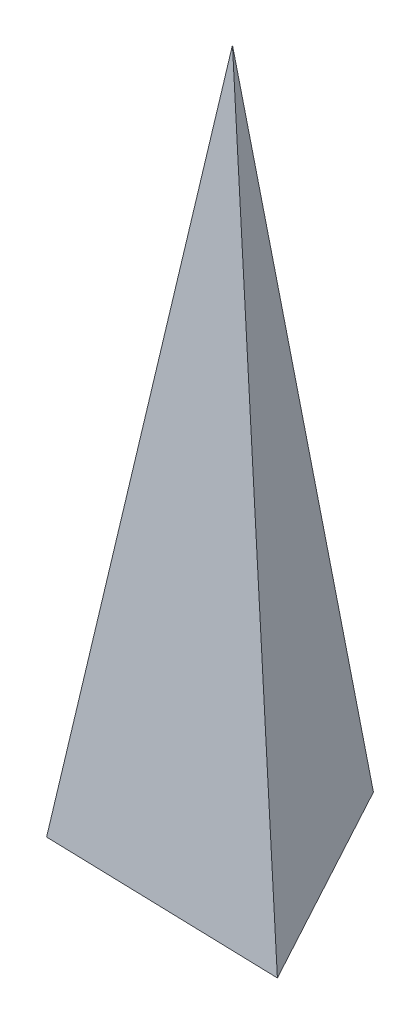
ISO-10303-21;
HEADER;
FILE_DESCRIPTION(('STEP AP214'),'2;1');
FILE_NAME('part.step','',(''),(''),'','','');
FILE_SCHEMA(('AUTOMOTIVE_DESIGN { 1 0 10303 214 1 1 1 1 }'));
ENDSEC;
DATA;
#1=APPLICATION_CONTEXT('core data for automotive mechanical design processes');
#2=APPLICATION_PROTOCOL_DEFINITION('international standard','automotive_design',2000,#1);
#3=PRODUCT_CONTEXT('',#1,'mechanical');
#4=PRODUCT('Part','Part','',(#3));
#5=PRODUCT_RELATED_PRODUCT_CATEGORY('part','',(#4));
#6=PRODUCT_DEFINITION_FORMATION('','',#4);
#7=PRODUCT_DEFINITION_CONTEXT('part definition',#1,'design');
#8=PRODUCT_DEFINITION('design','',#6,#7);
#9=PRODUCT_DEFINITION_SHAPE('','',#8);
#10=(LENGTH_UNIT() NAMED_UNIT(*) SI_UNIT(.MILLI.,.METRE.));
#11=(NAMED_UNIT(*) PLANE_ANGLE_UNIT() SI_UNIT($,.RADIAN.));
#12=(NAMED_UNIT(*) SI_UNIT($,.STERADIAN.) SOLID_ANGLE_UNIT());
#13=UNCERTAINTY_MEASURE_WITH_UNIT(LENGTH_MEASURE(1.E-05),#10,'distance_accuracy_value','');
#14=(GEOMETRIC_REPRESENTATION_CONTEXT(3) GLOBAL_UNCERTAINTY_ASSIGNED_CONTEXT((#13)) GLOBAL_UNIT_ASSIGNED_CONTEXT((#10,
#11,#12)) REPRESENTATION_CONTEXT('',''));
#15=CARTESIAN_POINT('',(0.,0.,0.));
#16=DIRECTION('',(0.,0.,1.));
#17=DIRECTION('',(1.,0.,0.));
#18=AXIS2_PLACEMENT_3D('',#15,#16,#17);
#19=CARTESIAN_POINT('',(-12.6975323008911,0.,6.86338158644562));
#20=DIRECTION('',(-0.0279238469086223,0.0956720216510585,0.995021167135164));
#21=DIRECTION('',(0.,-0.995409323658619,0.0957093431880695));
#22=AXIS2_PLACEMENT_3D('',#19,#20,#21);
#23=PLANE('',#22);
#24=DIRECTION('',(0.999606450442595,0.,0.0280525263310692));
#25=VECTOR('',#24,1.);
#26=CARTESIAN_POINT('',(-12.6975323008911,0.,6.86338158644562));
#27=LINE('',#26,#25);
#28=CARTESIAN_POINT('',(-12.6975323008911,0.,6.86338158644562));
#29=VERTEX_POINT('',#28);
#30=CARTESIAN_POINT('',(12.2926289601738,0.,7.56469474472235));
#31=VERTEX_POINT('',#30);
#32=EDGE_CURVE('E73',#29,#31,#27,.T.);
#33=ORIENTED_EDGE('',*,*,#32,.T.);
#34=DIRECTION('',(0.160767405181608,-0.98202135774224,0.0989337878040668));
#35=VECTOR('',#34,1.);
#36=CARTESIAN_POINT('',(12.2926289601738,0.,7.56469474472235));
#37=LINE('',#36,#35);
#38=CARTESIAN_POINT('',(0.0143263616009179,75.,0.00881622252364104));
#39=VERTEX_POINT('',#38);
#40=EDGE_CURVE('E11',#39,#31,#37,.T.);
#41=ORIENTED_EDGE('',*,*,#40,.F.);
#42=DIRECTION('',(-0.999606450442595,0.,-0.0280525263310692));
#43=VECTOR('',#42,1.);
#44=CARTESIAN_POINT('',(-12.4953165764677,75.,-0.342249026962356));
#45=LINE('',#44,#43);
#46=CARTESIAN_POINT('',(-0.014798253471346,75.,0.00799888182837455));
#47=VERTEX_POINT('',#46);
#48=EDGE_CURVE('E85',#47,#39,#45,.F.);
#49=ORIENTED_EDGE('',*,*,#48,.F.);
#50=DIRECTION('',(-0.166062876121745,-0.98202135774224,0.0897617630857453));
#51=VECTOR('',#50,1.);
#52=CARTESIAN_POINT('',(-12.6975323008911,0.,6.86338158644562));
#53=LINE('',#52,#51);
#54=EDGE_CURVE('E82',#47,#29,#53,.T.);
#55=ORIENTED_EDGE('',*,*,#54,.T.);
#56=EDGE_LOOP('',(#33,#41,#49,#55));
#57=FACE_BOUND('',#56,.T.);
#58=ADVANCED_FACE('F35',(#57),#23,.T.);
#59=CARTESIAN_POINT('',(12.2926289601738,0.,7.56469474472235));
#60=DIRECTION('',(0.875675531496605,0.0956720216510585,-0.473327822773327));
#61=DIRECTION('',(-0.47550902477826,0.,-0.879710843035613));
#62=AXIS2_PLACEMENT_3D('',#59,#60,#61);
#63=PLANE('',#62);
#64=DIRECTION('',(-0.47550902477826,0.,-0.879710843035613));
#65=VECTOR('',#64,1.);
#66=CARTESIAN_POINT('',(12.2926289601738,0.,7.56469474472235));
#67=LINE('',#66,#65);
#68=CARTESIAN_POINT('',(0.404903340717301,0.,-14.428076331168));
#69=VERTEX_POINT('',#68);
#70=EDGE_CURVE('E70',#31,#69,#67,.T.);
#71=ORIENTED_EDGE('',*,*,#70,.T.);
#72=DIRECTION('',(0.00529547094013685,-0.98202135774224,-0.188695550889812));
#73=VECTOR('',#72,1.);
#74=CARTESIAN_POINT('',(0.404903340717303,0.,-14.428076331168));
#75=LINE('',#74,#73);
#76=CARTESIAN_POINT('',(0.000471891870433183,75.,-0.0168151043520161));
#77=VERTEX_POINT('',#76);
#78=EDGE_CURVE('E44',#77,#69,#75,.T.);
#79=ORIENTED_EDGE('',*,*,#78,.F.);
#80=DIRECTION('',(0.47550902477826,0.,0.879710843035613));
#81=VECTOR('',#80,1.);
#82=CARTESIAN_POINT('',(5.95126193646392,75.,10.992386097031));
#83=LINE('',#82,#81);
#84=EDGE_CURVE('E55',#39,#77,#83,.F.);
#85=ORIENTED_EDGE('',*,*,#84,.F.);
#86=ORIENTED_EDGE('',*,*,#40,.T.);
#87=EDGE_LOOP('',(#71,#79,#85,#86));
#88=FACE_BOUND('',#87,.T.);
#89=ADVANCED_FACE('F37',(#88),#63,.T.);
#90=CARTESIAN_POINT('',(0.404903340717301,0.,-14.428076331168));
#91=DIRECTION('',(-0.847751684587982,0.0956720216510585,-0.521693344361837));
#92=DIRECTION('',(-0.524097425664336,0.,0.851658316704543));
#93=AXIS2_PLACEMENT_3D('',#90,#91,#92);
#94=PLANE('',#93);
#95=DIRECTION('',(-0.524097425664336,0.,0.851658316704543));
#96=VECTOR('',#95,1.);
#97=CARTESIAN_POINT('',(0.404903340717301,0.,-14.428076331168));
#98=LINE('',#97,#96);
#99=EDGE_CURVE('E74',#69,#29,#98,.T.);
#100=ORIENTED_EDGE('',*,*,#99,.T.);
#101=ORIENTED_EDGE('',*,*,#54,.F.);
#102=DIRECTION('',(0.524097425664336,0.,-0.851658316704543));
#103=VECTOR('',#102,1.);
#104=CARTESIAN_POINT('',(6.54405464000374,75.,-10.6501370700686));
#105=LINE('',#104,#103);
#106=EDGE_CURVE('E39',#77,#47,#105,.F.);
#107=ORIENTED_EDGE('',*,*,#106,.F.);
#108=ORIENTED_EDGE('',*,*,#78,.T.);
#109=EDGE_LOOP('',(#100,#101,#107,#108));
#110=FACE_BOUND('',#109,.T.);
#111=ADVANCED_FACE('F91',(#110),#94,.T.);
#112=CARTESIAN_POINT('',(0.,75.,0.));
#113=DIRECTION('',(0.,1.,0.));
#114=DIRECTION('',(0.,0.,1.));
#115=AXIS2_PLACEMENT_3D('',#112,#113,#114);
#116=PLANE('',#115);
#117=ORIENTED_EDGE('',*,*,#48,.T.);
#118=ORIENTED_EDGE('',*,*,#84,.T.);
#119=ORIENTED_EDGE('',*,*,#106,.T.);
#120=EDGE_LOOP('',(#117,#118,#119));
#121=FACE_BOUND('',#120,.T.);
#122=ADVANCED_FACE('F89',(#121),#116,.T.);
#123=CARTESIAN_POINT('',(0.,0.,0.));
#124=DIRECTION('',(0.,1.,0.));
#125=DIRECTION('',(0.,0.,1.));
#126=AXIS2_PLACEMENT_3D('',#123,#124,#125);
#127=PLANE('',#126);
#128=ORIENTED_EDGE('',*,*,#32,.F.);
#129=ORIENTED_EDGE('',*,*,#99,.F.);
#130=ORIENTED_EDGE('',*,*,#70,.F.);
#131=EDGE_LOOP('',(#128,#129,#130));
#132=FACE_BOUND('',#131,.T.);
#133=ADVANCED_FACE('F71',(#132),#127,.F.);
#134=CLOSED_SHELL('',(#58,#89,#111,#122,#133));
#135=MANIFOLD_SOLID_BREP('B2',#134);
#136=ADVANCED_BREP_SHAPE_REPRESENTATION('',(#18,#135),#14);
#137=SHAPE_DEFINITION_REPRESENTATION(#9,#136);
ENDSEC;
END-ISO-10303-21;
